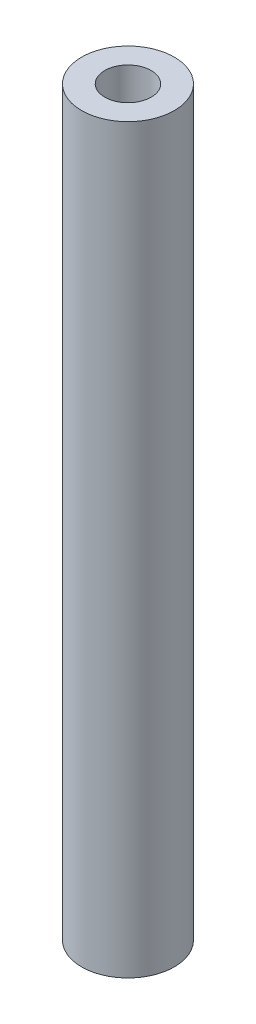
ISO-10303-21;
HEADER;
FILE_DESCRIPTION(('STEP AP214'),'2;1');
FILE_NAME('part.step','',(''),(''),'','','');
FILE_SCHEMA(('AUTOMOTIVE_DESIGN { 1 0 10303 214 1 1 1 1 }'));
ENDSEC;
DATA;
#1=APPLICATION_CONTEXT('core data for automotive mechanical design processes');
#2=APPLICATION_PROTOCOL_DEFINITION('international standard','automotive_design',2000,#1);
#3=PRODUCT_CONTEXT('',#1,'mechanical');
#4=PRODUCT('Part','Part','',(#3));
#5=PRODUCT_RELATED_PRODUCT_CATEGORY('part','',(#4));
#6=PRODUCT_DEFINITION_FORMATION('','',#4);
#7=PRODUCT_DEFINITION_CONTEXT('part definition',#1,'design');
#8=PRODUCT_DEFINITION('design','',#6,#7);
#9=PRODUCT_DEFINITION_SHAPE('','',#8);
#10=(LENGTH_UNIT() NAMED_UNIT(*) SI_UNIT(.MILLI.,.METRE.));
#11=(NAMED_UNIT(*) PLANE_ANGLE_UNIT() SI_UNIT($,.RADIAN.));
#12=(NAMED_UNIT(*) SI_UNIT($,.STERADIAN.) SOLID_ANGLE_UNIT());
#13=UNCERTAINTY_MEASURE_WITH_UNIT(LENGTH_MEASURE(1.E-05),#10,'distance_accuracy_value','');
#14=(GEOMETRIC_REPRESENTATION_CONTEXT(3) GLOBAL_UNCERTAINTY_ASSIGNED_CONTEXT((#13)) GLOBAL_UNIT_ASSIGNED_CONTEXT((#10,
#11,#12)) REPRESENTATION_CONTEXT('',''));
#15=CARTESIAN_POINT('',(0.,0.,0.));
#16=DIRECTION('',(0.,0.,1.));
#17=DIRECTION('',(1.,0.,0.));
#18=AXIS2_PLACEMENT_3D('',#15,#16,#17);
#19=CARTESIAN_POINT('',(0.,64.,0.));
#20=DIRECTION('',(0.,-1.,0.));
#21=DIRECTION('',(0.,0.,-1.));
#22=AXIS2_PLACEMENT_3D('',#19,#20,#21);
#23=CYLINDRICAL_SURFACE('',#22,4.);
#24=CARTESIAN_POINT('',(0.,64.,0.));
#25=DIRECTION('',(0.,1.,0.));
#26=DIRECTION('',(0.,0.,1.));
#27=AXIS2_PLACEMENT_3D('',#24,#25,#26);
#28=CIRCLE('',#27,4.);
#29=CARTESIAN_POINT('',(0.,64.,4.));
#30=VERTEX_POINT('',#29);
#31=EDGE_CURVE('E10',#30,#30,#28,.T.);
#32=ORIENTED_EDGE('',*,*,#31,.F.);
#33=EDGE_LOOP('',(#32));
#34=FACE_BOUND('',#33,.T.);
#35=CARTESIAN_POINT('',(0.,0.,0.));
#36=DIRECTION('',(0.,1.,0.));
#37=DIRECTION('',(0.,0.,1.));
#38=AXIS2_PLACEMENT_3D('',#35,#36,#37);
#39=CIRCLE('',#38,4.);
#40=CARTESIAN_POINT('',(0.,0.,4.));
#41=VERTEX_POINT('',#40);
#42=EDGE_CURVE('E40',#41,#41,#39,.T.);
#43=ORIENTED_EDGE('',*,*,#42,.T.);
#44=EDGE_LOOP('',(#43));
#45=FACE_BOUND('',#44,.T.);
#46=ADVANCED_FACE('F37',(#34,#45),#23,.T.);
#47=CARTESIAN_POINT('',(0.,64.,0.));
#48=DIRECTION('',(0.,1.,0.));
#49=DIRECTION('',(0.,0.,1.));
#50=AXIS2_PLACEMENT_3D('',#47,#48,#49);
#51=PLANE('',#50);
#52=CARTESIAN_POINT('',(0.,64.,0.));
#53=DIRECTION('',(0.,1.,0.));
#54=DIRECTION('',(0.,0.,1.));
#55=AXIS2_PLACEMENT_3D('',#52,#53,#54);
#56=CIRCLE('',#55,2.);
#57=CARTESIAN_POINT('',(0.,64.,2.));
#58=VERTEX_POINT('',#57);
#59=EDGE_CURVE('E49',#58,#58,#56,.T.);
#60=ORIENTED_EDGE('',*,*,#59,.F.);
#61=EDGE_LOOP('',(#60));
#62=FACE_BOUND('',#61,.T.);
#63=ORIENTED_EDGE('',*,*,#31,.T.);
#64=EDGE_LOOP('',(#63));
#65=FACE_BOUND('',#64,.T.);
#66=ADVANCED_FACE('F64',(#62,#65),#51,.T.);
#67=CARTESIAN_POINT('',(0.,0.,0.));
#68=DIRECTION('',(0.,1.,0.));
#69=DIRECTION('',(0.,0.,1.));
#70=AXIS2_PLACEMENT_3D('',#67,#68,#69);
#71=PLANE('',#70);
#72=ORIENTED_EDGE('',*,*,#42,.F.);
#73=EDGE_LOOP('',(#72));
#74=FACE_BOUND('',#73,.T.);
#75=ADVANCED_FACE('F60',(#74),#71,.F.);
#76=CARTESIAN_POINT('',(0.,54.,0.));
#77=DIRECTION('',(0.,1.,0.));
#78=DIRECTION('',(0.,0.,1.));
#79=AXIS2_PLACEMENT_3D('',#76,#77,#78);
#80=CYLINDRICAL_SURFACE('',#79,2.);
#81=CARTESIAN_POINT('',(0.,54.,0.));
#82=DIRECTION('',(0.,1.,0.));
#83=DIRECTION('',(0.,0.,1.));
#84=AXIS2_PLACEMENT_3D('',#81,#82,#83);
#85=CIRCLE('',#84,2.);
#86=CARTESIAN_POINT('',(0.,54.,2.));
#87=VERTEX_POINT('',#86);
#88=EDGE_CURVE('E47',#87,#87,#85,.T.);
#89=ORIENTED_EDGE('',*,*,#88,.F.);
#90=EDGE_LOOP('',(#89));
#91=FACE_BOUND('',#90,.T.);
#92=ORIENTED_EDGE('',*,*,#59,.T.);
#93=EDGE_LOOP('',(#92));
#94=FACE_BOUND('',#93,.T.);
#95=ADVANCED_FACE('F57',(#91,#94),#80,.F.);
#96=CARTESIAN_POINT('',(0.,54.,0.));
#97=DIRECTION('',(0.,1.,0.));
#98=DIRECTION('',(0.,0.,1.));
#99=AXIS2_PLACEMENT_3D('',#96,#97,#98);
#100=PLANE('',#99);
#101=ORIENTED_EDGE('',*,*,#88,.T.);
#102=EDGE_LOOP('',(#101));
#103=FACE_BOUND('',#102,.T.);
#104=ADVANCED_FACE('F55',(#103),#100,.T.);
#105=CLOSED_SHELL('',(#46,#66,#75,#95,#104));
#106=MANIFOLD_SOLID_BREP('B2',#105);
#107=ADVANCED_BREP_SHAPE_REPRESENTATION('',(#18,#106),#14);
#108=SHAPE_DEFINITION_REPRESENTATION(#9,#107);
ENDSEC;
END-ISO-10303-21;
